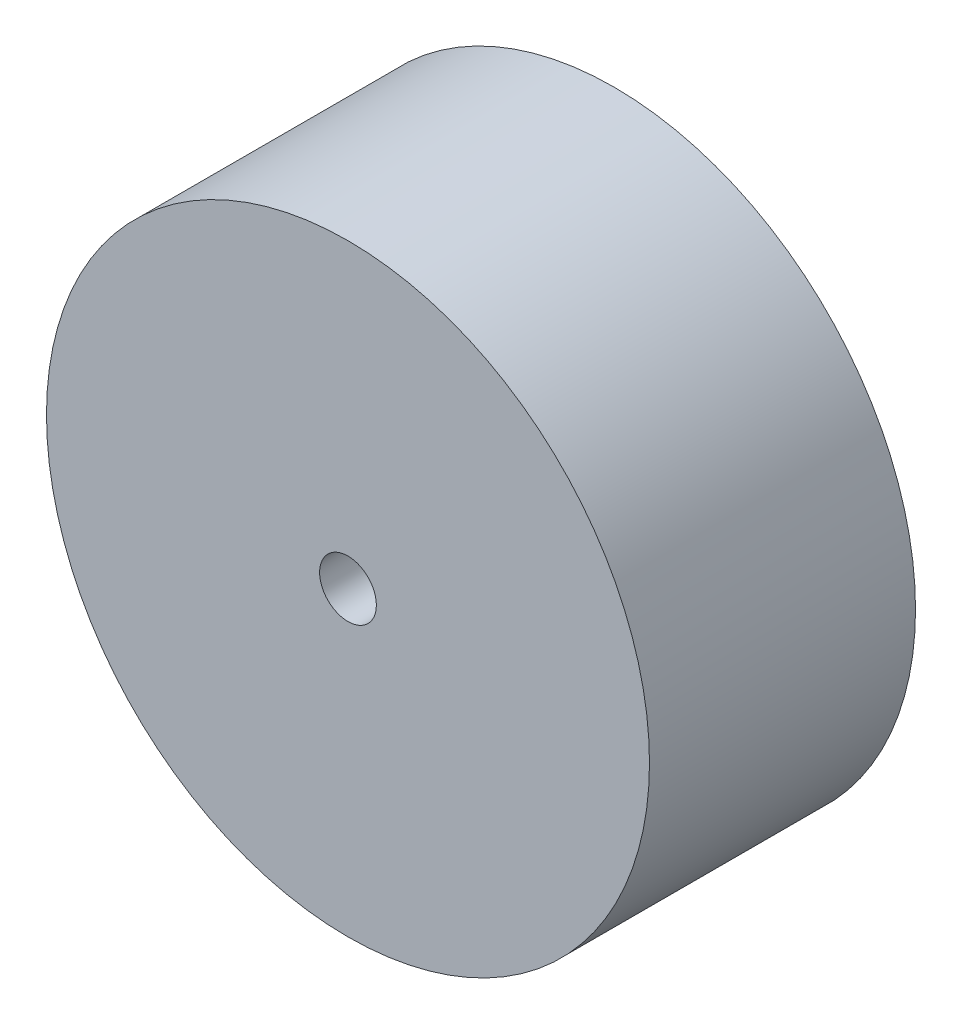
ISO-10303-21;
HEADER;
FILE_DESCRIPTION(('STEP AP214'),'2;1');
FILE_NAME('part.step','',(''),(''),'','','');
FILE_SCHEMA(('AUTOMOTIVE_DESIGN { 1 0 10303 214 1 1 1 1 }'));
ENDSEC;
DATA;
#1=APPLICATION_CONTEXT('core data for automotive mechanical design processes');
#2=APPLICATION_PROTOCOL_DEFINITION('international standard','automotive_design',2000,#1);
#3=PRODUCT_CONTEXT('',#1,'mechanical');
#4=PRODUCT('Part','Part','',(#3));
#5=PRODUCT_RELATED_PRODUCT_CATEGORY('part','',(#4));
#6=PRODUCT_DEFINITION_FORMATION('','',#4);
#7=PRODUCT_DEFINITION_CONTEXT('part definition',#1,'design');
#8=PRODUCT_DEFINITION('design','',#6,#7);
#9=PRODUCT_DEFINITION_SHAPE('','',#8);
#10=(LENGTH_UNIT() NAMED_UNIT(*) SI_UNIT(.MILLI.,.METRE.));
#11=(NAMED_UNIT(*) PLANE_ANGLE_UNIT() SI_UNIT($,.RADIAN.));
#12=(NAMED_UNIT(*) SI_UNIT($,.STERADIAN.) SOLID_ANGLE_UNIT());
#13=UNCERTAINTY_MEASURE_WITH_UNIT(LENGTH_MEASURE(1.E-05),#10,'distance_accuracy_value','');
#14=(GEOMETRIC_REPRESENTATION_CONTEXT(3) GLOBAL_UNCERTAINTY_ASSIGNED_CONTEXT((#13)) GLOBAL_UNIT_ASSIGNED_CONTEXT((#10,
#11,#12)) REPRESENTATION_CONTEXT('',''));
#15=CARTESIAN_POINT('',(0.,0.,0.));
#16=DIRECTION('',(0.,0.,1.));
#17=DIRECTION('',(1.,0.,0.));
#18=AXIS2_PLACEMENT_3D('',#15,#16,#17);
#19=CARTESIAN_POINT('',(0.,0.,15.));
#20=DIRECTION('',(0.,0.,1.));
#21=DIRECTION('',(1.,0.,0.));
#22=AXIS2_PLACEMENT_3D('',#19,#20,#21);
#23=PLANE('',#22);
#24=CARTESIAN_POINT('',(0.,0.,15.));
#25=DIRECTION('',(0.,0.,1.));
#26=DIRECTION('',(1.,0.,0.));
#27=AXIS2_PLACEMENT_3D('',#24,#25,#26);
#28=CIRCLE('',#27,17.);
#29=CARTESIAN_POINT('',(17.,0.,15.));
#30=VERTEX_POINT('',#29);
#31=EDGE_CURVE('E10',#30,#30,#28,.T.);
#32=ORIENTED_EDGE('',*,*,#31,.T.);
#33=EDGE_LOOP('',(#32));
#34=FACE_BOUND('',#33,.T.);
#35=CARTESIAN_POINT('',(0.,0.,15.));
#36=DIRECTION('',(0.,0.,1.));
#37=DIRECTION('',(1.,0.,0.));
#38=AXIS2_PLACEMENT_3D('',#35,#36,#37);
#39=CIRCLE('',#38,1.6);
#40=CARTESIAN_POINT('',(1.6,0.,15.));
#41=VERTEX_POINT('',#40);
#42=EDGE_CURVE('E50',#41,#41,#39,.T.);
#43=ORIENTED_EDGE('',*,*,#42,.F.);
#44=EDGE_LOOP('',(#43));
#45=FACE_BOUND('',#44,.T.);
#46=ADVANCED_FACE('F37',(#34,#45),#23,.T.);
#47=CARTESIAN_POINT('',(0.,0.,0.));
#48=DIRECTION('',(0.,0.,1.));
#49=DIRECTION('',(1.,0.,0.));
#50=AXIS2_PLACEMENT_3D('',#47,#48,#49);
#51=PLANE('',#50);
#52=CARTESIAN_POINT('',(0.,0.,0.));
#53=DIRECTION('',(0.,0.,1.));
#54=DIRECTION('',(1.,0.,0.));
#55=AXIS2_PLACEMENT_3D('',#52,#53,#54);
#56=CIRCLE('',#55,17.);
#57=CARTESIAN_POINT('',(17.,0.,0.));
#58=VERTEX_POINT('',#57);
#59=EDGE_CURVE('E41',#58,#58,#56,.T.);
#60=ORIENTED_EDGE('',*,*,#59,.F.);
#61=EDGE_LOOP('',(#60));
#62=FACE_BOUND('',#61,.T.);
#63=CARTESIAN_POINT('',(0.,0.,0.));
#64=DIRECTION('',(0.,0.,1.));
#65=DIRECTION('',(1.,0.,0.));
#66=AXIS2_PLACEMENT_3D('',#63,#64,#65);
#67=CIRCLE('',#66,1.6);
#68=CARTESIAN_POINT('',(1.6,0.,0.));
#69=VERTEX_POINT('',#68);
#70=EDGE_CURVE('E52',#69,#69,#67,.T.);
#71=ORIENTED_EDGE('',*,*,#70,.T.);
#72=EDGE_LOOP('',(#71));
#73=FACE_BOUND('',#72,.T.);
#74=ADVANCED_FACE('F64',(#62,#73),#51,.F.);
#75=CARTESIAN_POINT('',(0.,0.,15.));
#76=DIRECTION('',(0.,0.,-1.));
#77=DIRECTION('',(-1.,0.,0.));
#78=AXIS2_PLACEMENT_3D('',#75,#76,#77);
#79=CYLINDRICAL_SURFACE('',#78,17.);
#80=ORIENTED_EDGE('',*,*,#31,.F.);
#81=EDGE_LOOP('',(#80));
#82=FACE_BOUND('',#81,.T.);
#83=ORIENTED_EDGE('',*,*,#59,.T.);
#84=EDGE_LOOP('',(#83));
#85=FACE_BOUND('',#84,.T.);
#86=ADVANCED_FACE('F39',(#82,#85),#79,.T.);
#87=CARTESIAN_POINT('',(0.,0.,15.));
#88=DIRECTION('',(0.,0.,-1.));
#89=DIRECTION('',(-1.,0.,0.));
#90=AXIS2_PLACEMENT_3D('',#87,#88,#89);
#91=CYLINDRICAL_SURFACE('',#90,1.6);
#92=ORIENTED_EDGE('',*,*,#42,.T.);
#93=EDGE_LOOP('',(#92));
#94=FACE_BOUND('',#93,.T.);
#95=ORIENTED_EDGE('',*,*,#70,.F.);
#96=EDGE_LOOP('',(#95));
#97=FACE_BOUND('',#96,.T.);
#98=ADVANCED_FACE('F60',(#94,#97),#91,.F.);
#99=CLOSED_SHELL('',(#46,#74,#86,#98));
#100=MANIFOLD_SOLID_BREP('B2',#99);
#101=ADVANCED_BREP_SHAPE_REPRESENTATION('',(#18,#100),#14);
#102=SHAPE_DEFINITION_REPRESENTATION(#9,#101);
ENDSEC;
END-ISO-10303-21;
